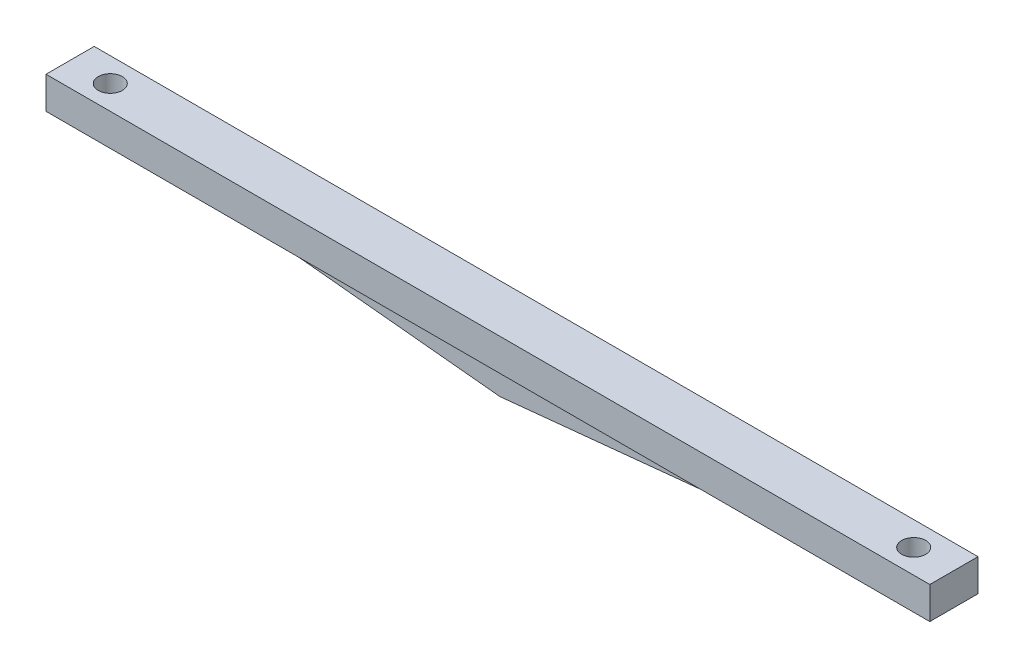
ISO-10303-21;
HEADER;
FILE_DESCRIPTION(('STEP AP214'),'2;1');
FILE_NAME('part.step','',(''),(''),'','','');
FILE_SCHEMA(('AUTOMOTIVE_DESIGN { 1 0 10303 214 1 1 1 1 }'));
ENDSEC;
DATA;
#1=APPLICATION_CONTEXT('core data for automotive mechanical design processes');
#2=APPLICATION_PROTOCOL_DEFINITION('international standard','automotive_design',2000,#1);
#3=PRODUCT_CONTEXT('',#1,'mechanical');
#4=PRODUCT('Part','Part','',(#3));
#5=PRODUCT_RELATED_PRODUCT_CATEGORY('part','',(#4));
#6=PRODUCT_DEFINITION_FORMATION('','',#4);
#7=PRODUCT_DEFINITION_CONTEXT('part definition',#1,'design');
#8=PRODUCT_DEFINITION('design','',#6,#7);
#9=PRODUCT_DEFINITION_SHAPE('','',#8);
#10=(LENGTH_UNIT() NAMED_UNIT(*) SI_UNIT(.MILLI.,.METRE.));
#11=(NAMED_UNIT(*) PLANE_ANGLE_UNIT() SI_UNIT($,.RADIAN.));
#12=(NAMED_UNIT(*) SI_UNIT($,.STERADIAN.) SOLID_ANGLE_UNIT());
#13=UNCERTAINTY_MEASURE_WITH_UNIT(LENGTH_MEASURE(1.E-05),#10,'distance_accuracy_value','');
#14=(GEOMETRIC_REPRESENTATION_CONTEXT(3) GLOBAL_UNCERTAINTY_ASSIGNED_CONTEXT((#13)) GLOBAL_UNIT_ASSIGNED_CONTEXT((#10,
#11,#12)) REPRESENTATION_CONTEXT('',''));
#15=CARTESIAN_POINT('',(0.,0.,0.));
#16=DIRECTION('',(0.,0.,1.));
#17=DIRECTION('',(1.,0.,0.));
#18=AXIS2_PLACEMENT_3D('',#15,#16,#17);
#19=CARTESIAN_POINT('',(-55.,-2.00000000000001,3.));
#20=DIRECTION('',(1.,0.,0.));
#21=DIRECTION('',(0.,0.,-1.));
#22=AXIS2_PLACEMENT_3D('',#19,#20,#21);
#23=PLANE('',#22);
#24=DIRECTION('',(0.,-1.,0.));
#25=VECTOR('',#24,1.);
#26=CARTESIAN_POINT('',(-55.,-2.00000000000001,-3.));
#27=LINE('',#26,#25);
#28=CARTESIAN_POINT('',(-55.,1.99999999999999,-3.));
#29=VERTEX_POINT('',#28);
#30=CARTESIAN_POINT('',(-55.,-2.00000000000001,-3.));
#31=VERTEX_POINT('',#30);
#32=EDGE_CURVE('E122',#29,#31,#27,.T.);
#33=ORIENTED_EDGE('',*,*,#32,.T.);
#34=DIRECTION('',(0.,0.,-1.));
#35=VECTOR('',#34,1.);
#36=CARTESIAN_POINT('',(-55.,-2.00000000000001,3.));
#37=LINE('',#36,#35);
#38=CARTESIAN_POINT('',(-55.,-2.00000000000001,3.));
#39=VERTEX_POINT('',#38);
#40=EDGE_CURVE('E11',#39,#31,#37,.T.);
#41=ORIENTED_EDGE('',*,*,#40,.F.);
#42=DIRECTION('',(0.,-1.,0.));
#43=VECTOR('',#42,1.);
#44=CARTESIAN_POINT('',(-55.,-2.00000000000001,3.));
#45=LINE('',#44,#43);
#46=CARTESIAN_POINT('',(-55.,1.99999999999999,3.));
#47=VERTEX_POINT('',#46);
#48=EDGE_CURVE('E131',#47,#39,#45,.T.);
#49=ORIENTED_EDGE('',*,*,#48,.F.);
#50=DIRECTION('',(0.,0.,-1.));
#51=VECTOR('',#50,1.);
#52=CARTESIAN_POINT('',(-55.,1.99999999999999,3.));
#53=LINE('',#52,#51);
#54=EDGE_CURVE('E136',#47,#29,#53,.T.);
#55=ORIENTED_EDGE('',*,*,#54,.T.);
#56=EDGE_LOOP('',(#33,#41,#49,#55));
#57=FACE_BOUND('',#56,.T.);
#58=ADVANCED_FACE('F34',(#57),#23,.F.);
#59=CARTESIAN_POINT('',(55.,-1.99999999999999,3.));
#60=DIRECTION('',(0.,1.,0.));
#61=DIRECTION('',(-1.,0.,0.));
#62=AXIS2_PLACEMENT_3D('',#59,#60,#61);
#63=PLANE('',#62);
#64=CARTESIAN_POINT('',(-50.,-2.00000000000001,0.));
#65=DIRECTION('',(0.,1.,0.));
#66=DIRECTION('',(-1.,0.,0.));
#67=AXIS2_PLACEMENT_3D('',#64,#65,#66);
#68=CIRCLE('',#67,1.5);
#69=CARTESIAN_POINT('',(-51.5,-2.00000000000001,0.));
#70=VERTEX_POINT('',#69);
#71=EDGE_CURVE('E180',#70,#70,#68,.T.);
#72=ORIENTED_EDGE('',*,*,#71,.T.);
#73=EDGE_LOOP('',(#72));
#74=FACE_BOUND('',#73,.T.);
#75=CARTESIAN_POINT('',(50.,-1.99999999999999,0.));
#76=DIRECTION('',(0.,1.,0.));
#77=DIRECTION('',(-1.,0.,0.));
#78=AXIS2_PLACEMENT_3D('',#75,#76,#77);
#79=CIRCLE('',#78,1.5);
#80=CARTESIAN_POINT('',(48.5,-1.99999999999999,0.));
#81=VERTEX_POINT('',#80);
#82=EDGE_CURVE('E183',#81,#81,#79,.T.);
#83=ORIENTED_EDGE('',*,*,#82,.T.);
#84=EDGE_LOOP('',(#83));
#85=FACE_BOUND('',#84,.T.);
#86=DIRECTION('',(0.,0.,-1.));
#87=VECTOR('',#86,1.);
#88=CARTESIAN_POINT('',(40.,-2.,1.5));
#89=LINE('',#88,#87);
#90=CARTESIAN_POINT('',(40.,-2.,1.5));
#91=VERTEX_POINT('',#90);
#92=CARTESIAN_POINT('',(40.,-2.,-1.5));
#93=VERTEX_POINT('',#92);
#94=EDGE_CURVE('E127',#91,#93,#89,.T.);
#95=ORIENTED_EDGE('',*,*,#94,.T.);
#96=DIRECTION('',(-1.,0.,0.));
#97=VECTOR('',#96,1.);
#98=CARTESIAN_POINT('',(-40.,-2.00000000000001,-1.5));
#99=LINE('',#98,#97);
#100=CARTESIAN_POINT('',(-40.,-2.00000000000001,-1.5));
#101=VERTEX_POINT('',#100);
#102=EDGE_CURVE('E48',#93,#101,#99,.T.);
#103=ORIENTED_EDGE('',*,*,#102,.T.);
#104=DIRECTION('',(0.,0.,-1.));
#105=VECTOR('',#104,1.);
#106=CARTESIAN_POINT('',(-40.,-2.00000000000001,1.5));
#107=LINE('',#106,#105);
#108=CARTESIAN_POINT('',(-40.,-2.00000000000001,1.5));
#109=VERTEX_POINT('',#108);
#110=EDGE_CURVE('E106',#109,#101,#107,.T.);
#111=ORIENTED_EDGE('',*,*,#110,.F.);
#112=DIRECTION('',(-1.,0.,0.));
#113=VECTOR('',#112,1.);
#114=CARTESIAN_POINT('',(-40.,-2.00000000000001,1.5));
#115=LINE('',#114,#113);
#116=EDGE_CURVE('E112',#91,#109,#115,.T.);
#117=ORIENTED_EDGE('',*,*,#116,.F.);
#118=EDGE_LOOP('',(#95,#103,#111,#117));
#119=FACE_BOUND('',#118,.T.);
#120=DIRECTION('',(1.,0.,0.));
#121=VECTOR('',#120,1.);
#122=CARTESIAN_POINT('',(55.,-1.99999999999999,-3.));
#123=LINE('',#122,#121);
#124=CARTESIAN_POINT('',(55.,-1.99999999999999,-3.));
#125=VERTEX_POINT('',#124);
#126=EDGE_CURVE('E125',#31,#125,#123,.T.);
#127=ORIENTED_EDGE('',*,*,#126,.T.);
#128=DIRECTION('',(0.,0.,-1.));
#129=VECTOR('',#128,1.);
#130=CARTESIAN_POINT('',(55.,-1.99999999999999,3.));
#131=LINE('',#130,#129);
#132=CARTESIAN_POINT('',(55.,-1.99999999999999,3.));
#133=VERTEX_POINT('',#132);
#134=EDGE_CURVE('E41',#133,#125,#131,.T.);
#135=ORIENTED_EDGE('',*,*,#134,.F.);
#136=DIRECTION('',(1.,0.,0.));
#137=VECTOR('',#136,1.);
#138=CARTESIAN_POINT('',(55.,-1.99999999999999,3.));
#139=LINE('',#138,#137);
#140=EDGE_CURVE('E85',#39,#133,#139,.T.);
#141=ORIENTED_EDGE('',*,*,#140,.F.);
#142=ORIENTED_EDGE('',*,*,#40,.T.);
#143=EDGE_LOOP('',(#127,#135,#141,#142));
#144=FACE_BOUND('',#143,.T.);
#145=ADVANCED_FACE('F121',(#74,#85,#119,#144),#63,.F.);
#146=CARTESIAN_POINT('',(55.,-1.99999999999999,3.));
#147=DIRECTION('',(-1.,0.,0.));
#148=DIRECTION('',(0.,0.,1.));
#149=AXIS2_PLACEMENT_3D('',#146,#147,#148);
#150=PLANE('',#149);
#151=DIRECTION('',(0.,1.,0.));
#152=VECTOR('',#151,1.);
#153=CARTESIAN_POINT('',(55.,-1.99999999999999,-3.));
#154=LINE('',#153,#152);
#155=CARTESIAN_POINT('',(55.,2.00000000000001,-3.));
#156=VERTEX_POINT('',#155);
#157=EDGE_CURVE('E139',#125,#156,#154,.T.);
#158=ORIENTED_EDGE('',*,*,#157,.T.);
#159=DIRECTION('',(0.,0.,-1.));
#160=VECTOR('',#159,1.);
#161=CARTESIAN_POINT('',(55.,2.00000000000001,3.));
#162=LINE('',#161,#160);
#163=CARTESIAN_POINT('',(55.,2.00000000000001,3.));
#164=VERTEX_POINT('',#163);
#165=EDGE_CURVE('E143',#164,#156,#162,.T.);
#166=ORIENTED_EDGE('',*,*,#165,.F.);
#167=DIRECTION('',(0.,1.,0.));
#168=VECTOR('',#167,1.);
#169=CARTESIAN_POINT('',(55.,-1.99999999999999,3.));
#170=LINE('',#169,#168);
#171=EDGE_CURVE('E134',#133,#164,#170,.T.);
#172=ORIENTED_EDGE('',*,*,#171,.F.);
#173=ORIENTED_EDGE('',*,*,#134,.T.);
#174=EDGE_LOOP('',(#158,#166,#172,#173));
#175=FACE_BOUND('',#174,.T.);
#176=ADVANCED_FACE('F148',(#175),#150,.F.);
#177=CARTESIAN_POINT('',(55.,2.00000000000001,3.));
#178=DIRECTION('',(0.,-1.,0.));
#179=DIRECTION('',(1.,0.,0.));
#180=AXIS2_PLACEMENT_3D('',#177,#178,#179);
#181=PLANE('',#180);
#182=CARTESIAN_POINT('',(-50.,1.99999999999999,0.));
#183=DIRECTION('',(0.,1.,0.));
#184=DIRECTION('',(0.,0.,1.));
#185=AXIS2_PLACEMENT_3D('',#182,#183,#184);
#186=CIRCLE('',#185,1.5);
#187=CARTESIAN_POINT('',(-50.,1.99999999999999,1.5));
#188=VERTEX_POINT('',#187);
#189=EDGE_CURVE('E265',#188,#188,#186,.T.);
#190=ORIENTED_EDGE('',*,*,#189,.F.);
#191=EDGE_LOOP('',(#190));
#192=FACE_BOUND('',#191,.T.);
#193=CARTESIAN_POINT('',(50.,2.00000000000001,0.));
#194=DIRECTION('',(0.,1.,0.));
#195=DIRECTION('',(0.,0.,1.));
#196=AXIS2_PLACEMENT_3D('',#193,#194,#195);
#197=CIRCLE('',#196,1.5);
#198=CARTESIAN_POINT('',(50.,2.00000000000001,1.5));
#199=VERTEX_POINT('',#198);
#200=EDGE_CURVE('E185',#199,#199,#197,.T.);
#201=ORIENTED_EDGE('',*,*,#200,.F.);
#202=EDGE_LOOP('',(#201));
#203=FACE_BOUND('',#202,.T.);
#204=DIRECTION('',(-1.,0.,0.));
#205=VECTOR('',#204,1.);
#206=CARTESIAN_POINT('',(55.,2.00000000000001,-3.));
#207=LINE('',#206,#205);
#208=EDGE_CURVE('E78',#156,#29,#207,.T.);
#209=ORIENTED_EDGE('',*,*,#208,.T.);
#210=ORIENTED_EDGE('',*,*,#54,.F.);
#211=DIRECTION('',(-1.,0.,0.));
#212=VECTOR('',#211,1.);
#213=CARTESIAN_POINT('',(55.,2.00000000000001,3.));
#214=LINE('',#213,#212);
#215=EDGE_CURVE('E57',#164,#47,#214,.T.);
#216=ORIENTED_EDGE('',*,*,#215,.F.);
#217=ORIENTED_EDGE('',*,*,#165,.T.);
#218=EDGE_LOOP('',(#209,#210,#216,#217));
#219=FACE_BOUND('',#218,.T.);
#220=ADVANCED_FACE('F156',(#192,#203,#219),#181,.F.);
#221=CARTESIAN_POINT('',(0.,0.,3.));
#222=DIRECTION('',(0.,0.,1.));
#223=DIRECTION('',(1.,0.,0.));
#224=AXIS2_PLACEMENT_3D('',#221,#222,#223);
#225=PLANE('',#224);
#226=ORIENTED_EDGE('',*,*,#48,.T.);
#227=ORIENTED_EDGE('',*,*,#140,.T.);
#228=ORIENTED_EDGE('',*,*,#171,.T.);
#229=ORIENTED_EDGE('',*,*,#215,.T.);
#230=EDGE_LOOP('',(#226,#227,#228,#229));
#231=FACE_BOUND('',#230,.T.);
#232=ADVANCED_FACE('F158',(#231),#225,.T.);
#233=CARTESIAN_POINT('',(0.,0.,-3.));
#234=DIRECTION('',(0.,0.,1.));
#235=DIRECTION('',(1.,0.,0.));
#236=AXIS2_PLACEMENT_3D('',#233,#234,#235);
#237=PLANE('',#236);
#238=ORIENTED_EDGE('',*,*,#32,.F.);
#239=ORIENTED_EDGE('',*,*,#208,.F.);
#240=ORIENTED_EDGE('',*,*,#157,.F.);
#241=ORIENTED_EDGE('',*,*,#126,.F.);
#242=EDGE_LOOP('',(#238,#239,#240,#241));
#243=FACE_BOUND('',#242,.T.);
#244=ADVANCED_FACE('F152',(#243),#237,.F.);
#245=CARTESIAN_POINT('',(-40.,-2.00000000000001,1.5));
#246=DIRECTION('',(0.0995037190209989,0.995037190209989,0.));
#247=DIRECTION('',(-0.995037190209989,0.0995037190209989,0.));
#248=AXIS2_PLACEMENT_3D('',#245,#246,#247);
#249=PLANE('',#248);
#250=DIRECTION('',(0.995037190209989,-0.0995037190209988,0.));
#251=VECTOR('',#250,1.);
#252=CARTESIAN_POINT('',(-40.,-2.00000000000001,-1.5));
#253=LINE('',#252,#251);
#254=CARTESIAN_POINT('',(0.,-6.,-1.5));
#255=VERTEX_POINT('',#254);
#256=EDGE_CURVE('E187',#101,#255,#253,.T.);
#257=ORIENTED_EDGE('',*,*,#256,.T.);
#258=DIRECTION('',(0.,0.,-1.));
#259=VECTOR('',#258,1.);
#260=CARTESIAN_POINT('',(0.,-6.,1.5));
#261=LINE('',#260,#259);
#262=CARTESIAN_POINT('',(0.,-6.,1.5));
#263=VERTEX_POINT('',#262);
#264=EDGE_CURVE('E108',#263,#255,#261,.T.);
#265=ORIENTED_EDGE('',*,*,#264,.F.);
#266=DIRECTION('',(0.995037190209989,-0.0995037190209988,0.));
#267=VECTOR('',#266,1.);
#268=CARTESIAN_POINT('',(-40.,-2.00000000000001,1.5));
#269=LINE('',#268,#267);
#270=EDGE_CURVE('E102',#109,#263,#269,.T.);
#271=ORIENTED_EDGE('',*,*,#270,.F.);
#272=ORIENTED_EDGE('',*,*,#110,.T.);
#273=EDGE_LOOP('',(#257,#265,#271,#272));
#274=FACE_BOUND('',#273,.T.);
#275=ADVANCED_FACE('F104',(#274),#249,.F.);
#276=CARTESIAN_POINT('',(0.,-6.,1.5));
#277=DIRECTION('',(-0.0995037190209991,0.995037190209989,0.));
#278=DIRECTION('',(-0.995037190209989,-0.0995037190209991,0.));
#279=AXIS2_PLACEMENT_3D('',#276,#277,#278);
#280=PLANE('',#279);
#281=DIRECTION('',(0.995037190209989,0.0995037190209991,0.));
#282=VECTOR('',#281,1.);
#283=CARTESIAN_POINT('',(0.,-6.,-1.5));
#284=LINE('',#283,#282);
#285=EDGE_CURVE('E119',#255,#93,#284,.T.);
#286=ORIENTED_EDGE('',*,*,#285,.T.);
#287=ORIENTED_EDGE('',*,*,#94,.F.);
#288=DIRECTION('',(0.995037190209989,0.0995037190209991,0.));
#289=VECTOR('',#288,1.);
#290=CARTESIAN_POINT('',(0.,-6.,1.5));
#291=LINE('',#290,#289);
#292=EDGE_CURVE('E111',#263,#91,#291,.T.);
#293=ORIENTED_EDGE('',*,*,#292,.F.);
#294=ORIENTED_EDGE('',*,*,#264,.T.);
#295=EDGE_LOOP('',(#286,#287,#293,#294));
#296=FACE_BOUND('',#295,.T.);
#297=ADVANCED_FACE('F196',(#296),#280,.F.);
#298=CARTESIAN_POINT('',(0.,0.,1.5));
#299=DIRECTION('',(0.,0.,1.));
#300=DIRECTION('',(1.,0.,0.));
#301=AXIS2_PLACEMENT_3D('',#298,#299,#300);
#302=PLANE('',#301);
#303=ORIENTED_EDGE('',*,*,#116,.T.);
#304=ORIENTED_EDGE('',*,*,#270,.T.);
#305=ORIENTED_EDGE('',*,*,#292,.T.);
#306=EDGE_LOOP('',(#303,#304,#305));
#307=FACE_BOUND('',#306,.T.);
#308=ADVANCED_FACE('F115',(#307),#302,.T.);
#309=CARTESIAN_POINT('',(0.,0.,-1.5));
#310=DIRECTION('',(0.,0.,1.));
#311=DIRECTION('',(1.,0.,0.));
#312=AXIS2_PLACEMENT_3D('',#309,#310,#311);
#313=PLANE('',#312);
#314=ORIENTED_EDGE('',*,*,#102,.F.);
#315=ORIENTED_EDGE('',*,*,#285,.F.);
#316=ORIENTED_EDGE('',*,*,#256,.F.);
#317=EDGE_LOOP('',(#314,#315,#316));
#318=FACE_BOUND('',#317,.T.);
#319=ADVANCED_FACE('F197',(#318),#313,.F.);
#320=CARTESIAN_POINT('',(50.,2.00000000000001,0.));
#321=DIRECTION('',(0.,1.,0.));
#322=DIRECTION('',(0.,0.,1.));
#323=AXIS2_PLACEMENT_3D('',#320,#321,#322);
#324=CYLINDRICAL_SURFACE('',#323,1.5);
#325=ORIENTED_EDGE('',*,*,#82,.F.);
#326=EDGE_LOOP('',(#325));
#327=FACE_BOUND('',#326,.T.);
#328=ORIENTED_EDGE('',*,*,#200,.T.);
#329=EDGE_LOOP('',(#328));
#330=FACE_BOUND('',#329,.T.);
#331=ADVANCED_FACE('F199',(#327,#330),#324,.F.);
#332=CARTESIAN_POINT('',(-50.,1.99999999999999,0.));
#333=DIRECTION('',(0.,1.,0.));
#334=DIRECTION('',(0.,0.,1.));
#335=AXIS2_PLACEMENT_3D('',#332,#333,#334);
#336=CYLINDRICAL_SURFACE('',#335,1.5);
#337=ORIENTED_EDGE('',*,*,#71,.F.);
#338=EDGE_LOOP('',(#337));
#339=FACE_BOUND('',#338,.T.);
#340=ORIENTED_EDGE('',*,*,#189,.T.);
#341=EDGE_LOOP('',(#340));
#342=FACE_BOUND('',#341,.T.);
#343=ADVANCED_FACE('F205',(#339,#342),#336,.F.);
#344=CLOSED_SHELL('',(#58,#145,#176,#220,#232,#244,#275,#297,#308,#319,#331,#343));
#345=MANIFOLD_SOLID_BREP('B2',#344);
#346=ADVANCED_BREP_SHAPE_REPRESENTATION('',(#18,#345),#14);
#347=SHAPE_DEFINITION_REPRESENTATION(#9,#346);
ENDSEC;
END-ISO-10303-21;
